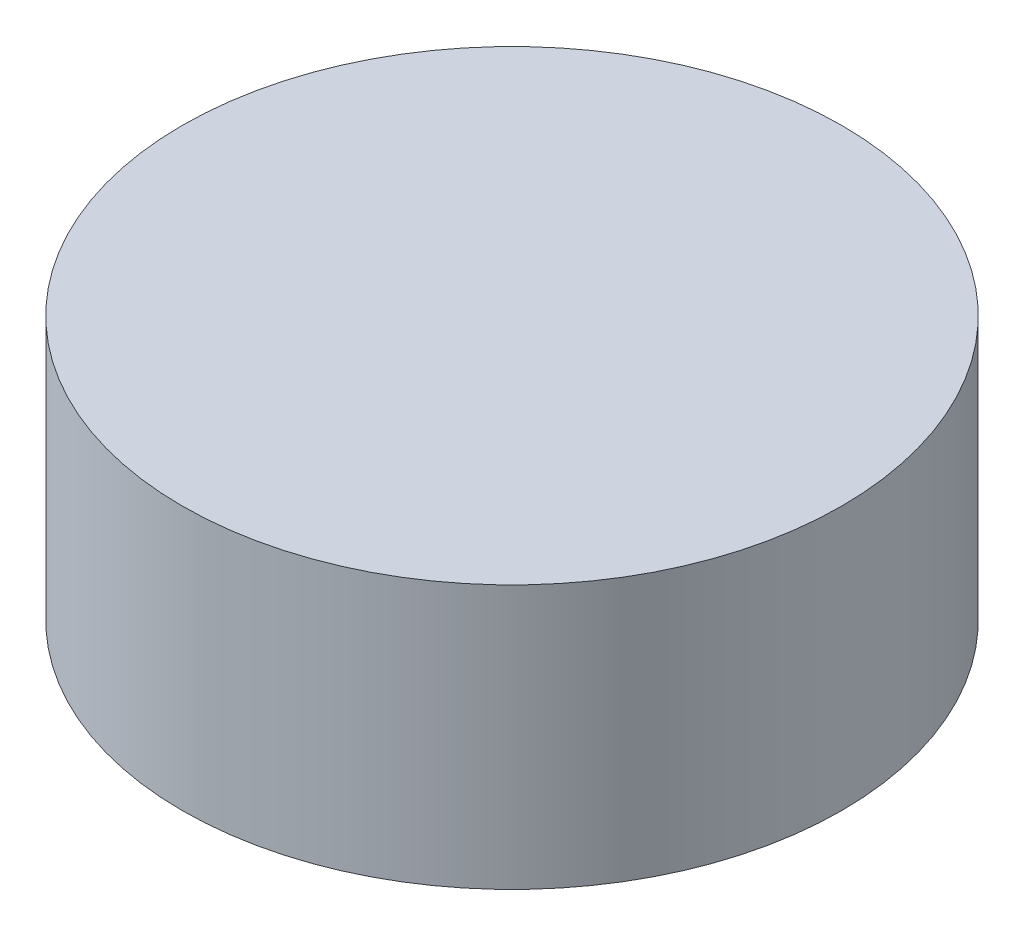
ISO-10303-21;
HEADER;
FILE_DESCRIPTION(('STEP AP214'),'2;1');
FILE_NAME('part.step','',(''),(''),'','','');
FILE_SCHEMA(('AUTOMOTIVE_DESIGN { 1 0 10303 214 1 1 1 1 }'));
ENDSEC;
DATA;
#1=APPLICATION_CONTEXT('core data for automotive mechanical design processes');
#2=APPLICATION_PROTOCOL_DEFINITION('international standard','automotive_design',2000,#1);
#3=PRODUCT_CONTEXT('',#1,'mechanical');
#4=PRODUCT('Part','Part','',(#3));
#5=PRODUCT_RELATED_PRODUCT_CATEGORY('part','',(#4));
#6=PRODUCT_DEFINITION_FORMATION('','',#4);
#7=PRODUCT_DEFINITION_CONTEXT('part definition',#1,'design');
#8=PRODUCT_DEFINITION('design','',#6,#7);
#9=PRODUCT_DEFINITION_SHAPE('','',#8);
#10=(LENGTH_UNIT() NAMED_UNIT(*) SI_UNIT(.MILLI.,.METRE.));
#11=(NAMED_UNIT(*) PLANE_ANGLE_UNIT() SI_UNIT($,.RADIAN.));
#12=(NAMED_UNIT(*) SI_UNIT($,.STERADIAN.) SOLID_ANGLE_UNIT());
#13=UNCERTAINTY_MEASURE_WITH_UNIT(LENGTH_MEASURE(1.E-05),#10,'distance_accuracy_value','');
#14=(GEOMETRIC_REPRESENTATION_CONTEXT(3) GLOBAL_UNCERTAINTY_ASSIGNED_CONTEXT((#13)) GLOBAL_UNIT_ASSIGNED_CONTEXT((#10,
#11,#12)) REPRESENTATION_CONTEXT('',''));
#15=CARTESIAN_POINT('',(0.,0.,0.));
#16=DIRECTION('',(0.,0.,1.));
#17=DIRECTION('',(1.,0.,0.));
#18=AXIS2_PLACEMENT_3D('',#15,#16,#17);
#19=CARTESIAN_POINT('',(0.,20.,0.));
#20=DIRECTION('',(0.,-1.,0.));
#21=DIRECTION('',(0.,0.,-1.));
#22=AXIS2_PLACEMENT_3D('',#19,#20,#21);
#23=CYLINDRICAL_SURFACE('',#22,25.);
#24=CARTESIAN_POINT('',(0.,20.,0.));
#25=DIRECTION('',(0.,1.,0.));
#26=DIRECTION('',(0.,0.,1.));
#27=AXIS2_PLACEMENT_3D('',#24,#25,#26);
#28=CIRCLE('',#27,25.);
#29=CARTESIAN_POINT('',(0.,20.,25.));
#30=VERTEX_POINT('',#29);
#31=EDGE_CURVE('E10',#30,#30,#28,.T.);
#32=ORIENTED_EDGE('',*,*,#31,.F.);
#33=EDGE_LOOP('',(#32));
#34=FACE_BOUND('',#33,.T.);
#35=CARTESIAN_POINT('',(0.,0.,0.));
#36=DIRECTION('',(0.,1.,0.));
#37=DIRECTION('',(0.,0.,1.));
#38=AXIS2_PLACEMENT_3D('',#35,#36,#37);
#39=CIRCLE('',#38,25.);
#40=CARTESIAN_POINT('',(0.,0.,25.));
#41=VERTEX_POINT('',#40);
#42=EDGE_CURVE('E46',#41,#41,#39,.T.);
#43=ORIENTED_EDGE('',*,*,#42,.T.);
#44=EDGE_LOOP('',(#43));
#45=FACE_BOUND('',#44,.T.);
#46=ADVANCED_FACE('F43',(#34,#45),#23,.T.);
#47=CARTESIAN_POINT('',(0.,20.,0.));
#48=DIRECTION('',(0.,1.,0.));
#49=DIRECTION('',(0.,0.,1.));
#50=AXIS2_PLACEMENT_3D('',#47,#48,#49);
#51=PLANE('',#50);
#52=ORIENTED_EDGE('',*,*,#31,.T.);
#53=EDGE_LOOP('',(#52));
#54=FACE_BOUND('',#53,.T.);
#55=ADVANCED_FACE('F60',(#54),#51,.T.);
#56=CARTESIAN_POINT('',(0.,0.,0.));
#57=DIRECTION('',(0.,1.,0.));
#58=DIRECTION('',(0.,0.,1.));
#59=AXIS2_PLACEMENT_3D('',#56,#57,#58);
#60=PLANE('',#59);
#61=ORIENTED_EDGE('',*,*,#42,.F.);
#62=EDGE_LOOP('',(#61));
#63=FACE_BOUND('',#62,.T.);
#64=ADVANCED_FACE('F58',(#63),#60,.F.);
#65=CLOSED_SHELL('',(#46,#55,#64));
#66=MANIFOLD_SOLID_BREP('B2',#65);
#67=ADVANCED_BREP_SHAPE_REPRESENTATION('',(#18,#66),#14);
#68=SHAPE_DEFINITION_REPRESENTATION(#9,#67);
ENDSEC;
END-ISO-10303-21;
